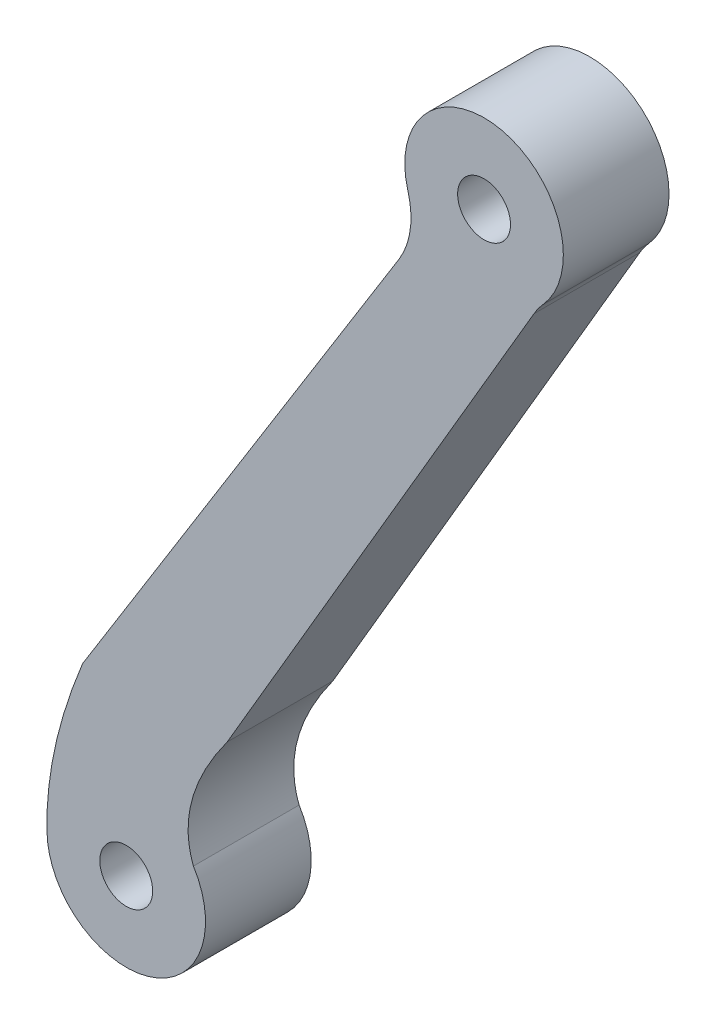
ISO-10303-21;
HEADER;
FILE_DESCRIPTION(('STEP AP214'),'2;1');
FILE_NAME('part.step','',(''),(''),'','','');
FILE_SCHEMA(('AUTOMOTIVE_DESIGN { 1 0 10303 214 1 1 1 1 }'));
ENDSEC;
DATA;
#1=APPLICATION_CONTEXT('core data for automotive mechanical design processes');
#2=APPLICATION_PROTOCOL_DEFINITION('international standard','automotive_design',2000,#1);
#3=PRODUCT_CONTEXT('',#1,'mechanical');
#4=PRODUCT('Part','Part','',(#3));
#5=PRODUCT_RELATED_PRODUCT_CATEGORY('part','',(#4));
#6=PRODUCT_DEFINITION_FORMATION('','',#4);
#7=PRODUCT_DEFINITION_CONTEXT('part definition',#1,'design');
#8=PRODUCT_DEFINITION('design','',#6,#7);
#9=PRODUCT_DEFINITION_SHAPE('','',#8);
#10=(LENGTH_UNIT() NAMED_UNIT(*) SI_UNIT(.MILLI.,.METRE.));
#11=(NAMED_UNIT(*) PLANE_ANGLE_UNIT() SI_UNIT($,.RADIAN.));
#12=(NAMED_UNIT(*) SI_UNIT($,.STERADIAN.) SOLID_ANGLE_UNIT());
#13=UNCERTAINTY_MEASURE_WITH_UNIT(LENGTH_MEASURE(1.E-05),#10,'distance_accuracy_value','');
#14=(GEOMETRIC_REPRESENTATION_CONTEXT(3) GLOBAL_UNCERTAINTY_ASSIGNED_CONTEXT((#13)) GLOBAL_UNIT_ASSIGNED_CONTEXT((#10,
#11,#12)) REPRESENTATION_CONTEXT('',''));
#15=CARTESIAN_POINT('',(0.,0.,0.));
#16=DIRECTION('',(0.,0.,1.));
#17=DIRECTION('',(1.,0.,0.));
#18=AXIS2_PLACEMENT_3D('',#15,#16,#17);
#19=CARTESIAN_POINT('',(18.0164608532114,94.1948252806854,4.));
#20=CARTESIAN_POINT('',(15.9886170182341,91.4157600232767,4.));
#21=CARTESIAN_POINT('',(16.7389516223177,89.4869260874124,4.));
#22=B_SPLINE_CURVE_WITH_KNOTS('',2,(#19,#20,#21),.UNSPECIFIED.,.F.,.F.,(3,3),(0.,1.),.UNSPECIFIED.);
#23=DIRECTION('',(0.,0.,-1.));
#24=VECTOR('',#23,1.);
#25=SURFACE_OF_LINEAR_EXTRUSION('',#22,#24);
#26=CARTESIAN_POINT('',(18.0164608532114,94.1948252806854,0.));
#27=CARTESIAN_POINT('',(15.9886170182341,91.4157600232767,0.));
#28=CARTESIAN_POINT('',(16.7389516223177,89.4869260874124,0.));
#29=B_SPLINE_CURVE_WITH_KNOTS('',2,(#26,#27,#28),.UNSPECIFIED.,.F.,.F.,(3,3),(0.,1.),.UNSPECIFIED.);
#30=CARTESIAN_POINT('',(18.0164608532114,94.1948252806854,0.));
#31=VERTEX_POINT('',#30);
#32=CARTESIAN_POINT('',(16.7389516223177,89.4869260874124,0.));
#33=VERTEX_POINT('',#32);
#34=EDGE_CURVE('E170',#31,#33,#29,.T.);
#35=ORIENTED_EDGE('',*,*,#34,.F.);
#36=DIRECTION('',(0.,0.,-1.));
#37=VECTOR('',#36,1.);
#38=CARTESIAN_POINT('',(18.0164608532114,94.1948252806854,4.));
#39=LINE('',#38,#37);
#40=CARTESIAN_POINT('',(18.0164608532114,94.1948252806854,4.));
#41=VERTEX_POINT('',#40);
#42=EDGE_CURVE('E11',#41,#31,#39,.T.);
#43=ORIENTED_EDGE('',*,*,#42,.F.);
#44=CARTESIAN_POINT('',(16.7389516223177,89.4869260874124,4.));
#45=VERTEX_POINT('',#44);
#46=EDGE_CURVE('E200',#41,#45,#22,.T.);
#47=ORIENTED_EDGE('',*,*,#46,.T.);
#48=DIRECTION('',(0.,0.,-1.));
#49=VECTOR('',#48,1.);
#50=CARTESIAN_POINT('',(16.7389516223177,89.4869260874124,4.));
#51=LINE('',#50,#49);
#52=EDGE_CURVE('E85',#45,#33,#51,.T.);
#53=ORIENTED_EDGE('',*,*,#52,.T.);
#54=EDGE_LOOP('',(#35,#43,#47,#53));
#55=FACE_BOUND('',#54,.T.);
#56=ADVANCED_FACE('F34',(#55),#25,.T.);
#57=CARTESIAN_POINT('',(-27.64151576103,16.1763745397966,4.));
#58=DIRECTION('',(0.863069254822422,-0.505085598072515,0.));
#59=DIRECTION('',(0.505085598072515,0.863069254822422,0.));
#60=AXIS2_PLACEMENT_3D('',#57,#58,#59);
#61=PLANE('',#60);
#62=DIRECTION('',(-0.505085598072515,-0.863069254822422,0.));
#63=VECTOR('',#62,1.);
#64=CARTESIAN_POINT('',(-27.64151576103,16.1763745397966,0.));
#65=LINE('',#64,#63);
#66=CARTESIAN_POINT('',(29.6287438279882,114.037411274176,0.));
#67=VERTEX_POINT('',#66);
#68=EDGE_CURVE('E163',#67,#31,#65,.T.);
#69=ORIENTED_EDGE('',*,*,#68,.F.);
#70=DIRECTION('',(0.,0.,-1.));
#71=VECTOR('',#70,1.);
#72=CARTESIAN_POINT('',(29.6287438279882,114.037411274176,4.));
#73=LINE('',#72,#71);
#74=CARTESIAN_POINT('',(29.6287438279882,114.037411274176,4.));
#75=VERTEX_POINT('',#74);
#76=EDGE_CURVE('E43',#75,#67,#73,.T.);
#77=ORIENTED_EDGE('',*,*,#76,.F.);
#78=DIRECTION('',(-0.505085598072515,-0.863069254822422,0.));
#79=VECTOR('',#78,1.);
#80=CARTESIAN_POINT('',(-27.64151576103,16.1763745397966,4.));
#81=LINE('',#80,#79);
#82=EDGE_CURVE('E212',#75,#41,#81,.T.);
#83=ORIENTED_EDGE('',*,*,#82,.T.);
#84=ORIENTED_EDGE('',*,*,#42,.T.);
#85=EDGE_LOOP('',(#69,#77,#83,#84));
#86=FACE_BOUND('',#85,.T.);
#87=ADVANCED_FACE('F154',(#86),#61,.T.);
#88=CARTESIAN_POINT('',(32.2179515924554,112.522154479959,4.));
#89=DIRECTION('',(0.,0.,-1.));
#90=DIRECTION('',(-1.,0.,0.));
#91=AXIS2_PLACEMENT_3D('',#88,#89,#90);
#92=CYLINDRICAL_SURFACE('',#91,3.00000000000001);
#93=CARTESIAN_POINT('',(32.2179515924554,112.522154479959,0.));
#94=DIRECTION('',(0.,0.,1.));
#95=DIRECTION('',(1.,0.,0.));
#96=AXIS2_PLACEMENT_3D('',#93,#94,#95);
#97=CIRCLE('',#96,3.00000000000001);
#98=CARTESIAN_POINT('',(29.977739071708,114.517511055082,0.));
#99=VERTEX_POINT('',#98);
#100=EDGE_CURVE('E169',#99,#67,#97,.T.);
#101=ORIENTED_EDGE('',*,*,#100,.F.);
#102=DIRECTION('',(0.,0.,-1.));
#103=VECTOR('',#102,1.);
#104=CARTESIAN_POINT('',(29.977739071708,114.517511055082,4.));
#105=LINE('',#104,#103);
#106=CARTESIAN_POINT('',(29.977739071708,114.517511055082,4.));
#107=VERTEX_POINT('',#106);
#108=EDGE_CURVE('E207',#107,#99,#105,.T.);
#109=ORIENTED_EDGE('',*,*,#108,.F.);
#110=CARTESIAN_POINT('',(32.2179515924554,112.522154479959,4.));
#111=DIRECTION('',(0.,0.,1.));
#112=DIRECTION('',(1.,0.,0.));
#113=AXIS2_PLACEMENT_3D('',#110,#111,#112);
#114=CIRCLE('',#113,3.00000000000001);
#115=EDGE_CURVE('E210',#107,#75,#114,.T.);
#116=ORIENTED_EDGE('',*,*,#115,.T.);
#117=ORIENTED_EDGE('',*,*,#76,.T.);
#118=EDGE_LOOP('',(#101,#109,#116,#117));
#119=FACE_BOUND('',#118,.T.);
#120=ADVANCED_FACE('F151',(#119),#92,.F.);
#121=CARTESIAN_POINT('',(27.7375265509606,116.512867630205,4.));
#122=DIRECTION('',(0.,0.,-1.));
#123=DIRECTION('',(-1.,0.,0.));
#124=AXIS2_PLACEMENT_3D('',#121,#122,#123);
#125=CYLINDRICAL_SURFACE('',#124,3.);
#126=CARTESIAN_POINT('',(27.7375265509606,116.512867630205,0.));
#127=DIRECTION('',(0.,0.,1.));
#128=DIRECTION('',(1.,0.,0.));
#129=AXIS2_PLACEMENT_3D('',#126,#127,#128);
#130=CIRCLE('',#129,3.);
#131=CARTESIAN_POINT('',(24.854741228717,115.682476887327,0.));
#132=VERTEX_POINT('',#131);
#133=EDGE_CURVE('E178',#99,#132,#130,.T.);
#134=ORIENTED_EDGE('',*,*,#133,.T.);
#135=DIRECTION('',(0.,0.,-1.));
#136=VECTOR('',#135,1.);
#137=CARTESIAN_POINT('',(24.854741228717,115.682476887327,4.));
#138=LINE('',#137,#136);
#139=CARTESIAN_POINT('',(24.854741228717,115.682476887327,4.));
#140=VERTEX_POINT('',#139);
#141=EDGE_CURVE('E205',#140,#132,#138,.T.);
#142=ORIENTED_EDGE('',*,*,#141,.F.);
#143=CARTESIAN_POINT('',(27.7375265509606,116.512867630205,4.));
#144=DIRECTION('',(0.,0.,1.));
#145=DIRECTION('',(1.,0.,0.));
#146=AXIS2_PLACEMENT_3D('',#143,#144,#145);
#147=CIRCLE('',#146,3.);
#148=EDGE_CURVE('E124',#107,#140,#147,.T.);
#149=ORIENTED_EDGE('',*,*,#148,.F.);
#150=ORIENTED_EDGE('',*,*,#108,.T.);
#151=EDGE_LOOP('',(#134,#142,#149,#150));
#152=FACE_BOUND('',#151,.T.);
#153=ADVANCED_FACE('F147',(#152),#125,.T.);
#154=CARTESIAN_POINT('',(21.9719559064734,114.85208614445,4.));
#155=DIRECTION('',(0.,0.,-1.));
#156=DIRECTION('',(-1.,0.,0.));
#157=AXIS2_PLACEMENT_3D('',#154,#155,#156);
#158=CYLINDRICAL_SURFACE('',#157,3.);
#159=CARTESIAN_POINT('',(21.9719559064734,114.85208614445,0.));
#160=DIRECTION('',(0.,0.,1.));
#161=DIRECTION('',(1.,0.,0.));
#162=AXIS2_PLACEMENT_3D('',#159,#160,#161);
#163=CIRCLE('',#162,3.);
#164=CARTESIAN_POINT('',(24.5189597292417,113.266913747893,0.));
#165=VERTEX_POINT('',#164);
#166=EDGE_CURVE('E180',#165,#132,#163,.T.);
#167=ORIENTED_EDGE('',*,*,#166,.F.);
#168=DIRECTION('',(0.,0.,-1.));
#169=VECTOR('',#168,1.);
#170=CARTESIAN_POINT('',(24.5189597292417,113.266913747893,4.));
#171=LINE('',#170,#169);
#172=CARTESIAN_POINT('',(24.5189597292417,113.266913747893,4.));
#173=VERTEX_POINT('',#172);
#174=EDGE_CURVE('E112',#173,#165,#171,.T.);
#175=ORIENTED_EDGE('',*,*,#174,.F.);
#176=CARTESIAN_POINT('',(21.9719559064734,114.85208614445,4.));
#177=DIRECTION('',(0.,0.,1.));
#178=DIRECTION('',(1.,0.,0.));
#179=AXIS2_PLACEMENT_3D('',#176,#177,#178);
#180=CIRCLE('',#179,3.);
#181=EDGE_CURVE('E122',#173,#140,#180,.T.);
#182=ORIENTED_EDGE('',*,*,#181,.T.);
#183=ORIENTED_EDGE('',*,*,#141,.T.);
#184=EDGE_LOOP('',(#167,#175,#182,#183));
#185=FACE_BOUND('',#184,.T.);
#186=ADVANCED_FACE('F144',(#185),#158,.F.);
#187=CARTESIAN_POINT('',(-33.1386991079217,20.6244492505586,4.));
#188=DIRECTION('',(-0.849001274256077,0.528390798852098,0.));
#189=DIRECTION('',(-0.528390798852098,-0.849001274256077,0.));
#190=AXIS2_PLACEMENT_3D('',#187,#188,#189);
#191=PLANE('',#190);
#192=DIRECTION('',(0.528390798852098,0.849001274256077,0.));
#193=VECTOR('',#192,1.);
#194=CARTESIAN_POINT('',(-33.1386991079217,20.6244492505586,0.));
#195=LINE('',#194,#193);
#196=CARTESIAN_POINT('',(12.5460152334742,94.0291731294213,0.));
#197=VERTEX_POINT('',#196);
#198=EDGE_CURVE('E111',#197,#165,#195,.T.);
#199=ORIENTED_EDGE('',*,*,#198,.F.);
#200=DIRECTION('',(0.,0.,-1.));
#201=VECTOR('',#200,1.);
#202=CARTESIAN_POINT('',(12.5460152334742,94.0291731294213,4.));
#203=LINE('',#202,#201);
#204=CARTESIAN_POINT('',(12.5460152334742,94.0291731294213,4.));
#205=VERTEX_POINT('',#204);
#206=EDGE_CURVE('E105',#205,#197,#203,.T.);
#207=ORIENTED_EDGE('',*,*,#206,.F.);
#208=DIRECTION('',(0.528390798852098,0.849001274256077,0.));
#209=VECTOR('',#208,1.);
#210=CARTESIAN_POINT('',(-33.1386991079217,20.6244492505586,4.));
#211=LINE('',#210,#209);
#212=EDGE_CURVE('E109',#205,#173,#211,.T.);
#213=ORIENTED_EDGE('',*,*,#212,.T.);
#214=ORIENTED_EDGE('',*,*,#174,.T.);
#215=EDGE_LOOP('',(#199,#207,#213,#214));
#216=FACE_BOUND('',#215,.T.);
#217=ADVANCED_FACE('F107',(#216),#191,.T.);
#218=CARTESIAN_POINT('',(12.5460152334742,94.0291731294213,4.));
#219=CARTESIAN_POINT('',(11.1432009751376,90.6207808117427,4.));
#220=CARTESIAN_POINT('',(11.1958575437404,87.8954888415541,4.));
#221=B_SPLINE_CURVE_WITH_KNOTS('',2,(#218,#219,#220),.UNSPECIFIED.,.F.,.F.,(3,3),(0.,1.),.UNSPECIFIED.);
#222=DIRECTION('',(0.,0.,-1.));
#223=VECTOR('',#222,1.);
#224=SURFACE_OF_LINEAR_EXTRUSION('',#221,#223);
#225=CARTESIAN_POINT('',(12.5460152334742,94.0291731294213,0.));
#226=CARTESIAN_POINT('',(11.1432009751376,90.6207808117427,0.));
#227=CARTESIAN_POINT('',(11.1958575437404,87.8954888415541,0.));
#228=B_SPLINE_CURVE_WITH_KNOTS('',2,(#225,#226,#227),.UNSPECIFIED.,.F.,.F.,(3,3),(0.,1.),.UNSPECIFIED.);
#229=CARTESIAN_POINT('',(11.1958575437404,87.8954888415541,0.));
#230=VERTEX_POINT('',#229);
#231=EDGE_CURVE('E78',#197,#230,#228,.T.);
#232=ORIENTED_EDGE('',*,*,#231,.T.);
#233=DIRECTION('',(0.,0.,-1.));
#234=VECTOR('',#233,1.);
#235=CARTESIAN_POINT('',(11.1958575437404,87.8954888415541,4.));
#236=LINE('',#235,#234);
#237=CARTESIAN_POINT('',(11.1958575437404,87.8954888415541,4.));
#238=VERTEX_POINT('',#237);
#239=EDGE_CURVE('E113',#238,#230,#236,.T.);
#240=ORIENTED_EDGE('',*,*,#239,.F.);
#241=EDGE_CURVE('E115',#205,#238,#221,.T.);
#242=ORIENTED_EDGE('',*,*,#241,.F.);
#243=ORIENTED_EDGE('',*,*,#206,.T.);
#244=EDGE_LOOP('',(#232,#240,#242,#243));
#245=FACE_BOUND('',#244,.T.);
#246=ADVANCED_FACE('F116',(#245),#224,.F.);
#247=CARTESIAN_POINT('',(27.7375265509606,116.512867630205,4.));
#248=DIRECTION('',(0.,0.,-1.));
#249=DIRECTION('',(-1.,0.,0.));
#250=AXIS2_PLACEMENT_3D('',#247,#248,#249);
#251=CYLINDRICAL_SURFACE('',#250,1.);
#252=CARTESIAN_POINT('',(27.7375265509606,116.512867630205,4.));
#253=DIRECTION('',(0.,0.,1.));
#254=DIRECTION('',(1.,0.,0.));
#255=AXIS2_PLACEMENT_3D('',#252,#253,#254);
#256=CIRCLE('',#255,1.);
#257=CARTESIAN_POINT('',(28.7375265509606,116.512867630205,4.));
#258=VERTEX_POINT('',#257);
#259=EDGE_CURVE('E229',#258,#258,#256,.T.);
#260=ORIENTED_EDGE('',*,*,#259,.T.);
#261=EDGE_LOOP('',(#260));
#262=FACE_BOUND('',#261,.T.);
#263=CARTESIAN_POINT('',(27.7375265509606,116.512867630205,0.));
#264=DIRECTION('',(0.,0.,1.));
#265=DIRECTION('',(1.,0.,0.));
#266=AXIS2_PLACEMENT_3D('',#263,#264,#265);
#267=CIRCLE('',#266,1.);
#268=CARTESIAN_POINT('',(28.7375265509606,116.512867630205,0.));
#269=VERTEX_POINT('',#268);
#270=EDGE_CURVE('E194',#269,#269,#267,.T.);
#271=ORIENTED_EDGE('',*,*,#270,.F.);
#272=EDGE_LOOP('',(#271));
#273=FACE_BOUND('',#272,.T.);
#274=ADVANCED_FACE('F139',(#262,#273),#251,.F.);
#275=CARTESIAN_POINT('',(14.1958575437404,87.8954888415541,4.));
#276=DIRECTION('',(0.,0.,-1.));
#277=DIRECTION('',(-1.,0.,0.));
#278=AXIS2_PLACEMENT_3D('',#275,#276,#277);
#279=CYLINDRICAL_SURFACE('',#278,3.);
#280=CARTESIAN_POINT('',(14.1958575437404,87.8954888415541,0.));
#281=DIRECTION('',(0.,0.,1.));
#282=DIRECTION('',(1.,0.,0.));
#283=AXIS2_PLACEMENT_3D('',#280,#281,#282);
#284=CIRCLE('',#283,3.);
#285=EDGE_CURVE('E189',#230,#33,#284,.T.);
#286=ORIENTED_EDGE('',*,*,#285,.T.);
#287=ORIENTED_EDGE('',*,*,#52,.F.);
#288=CARTESIAN_POINT('',(14.1958575437404,87.8954888415541,4.));
#289=DIRECTION('',(0.,0.,1.));
#290=DIRECTION('',(1.,0.,0.));
#291=AXIS2_PLACEMENT_3D('',#288,#289,#290);
#292=CIRCLE('',#291,3.);
#293=EDGE_CURVE('E51',#238,#45,#292,.T.);
#294=ORIENTED_EDGE('',*,*,#293,.F.);
#295=ORIENTED_EDGE('',*,*,#239,.T.);
#296=EDGE_LOOP('',(#286,#287,#294,#295));
#297=FACE_BOUND('',#296,.T.);
#298=ADVANCED_FACE('F140',(#297),#279,.T.);
#299=CARTESIAN_POINT('',(14.1958575437404,87.8954888415541,4.));
#300=DIRECTION('',(0.,0.,-1.));
#301=DIRECTION('',(-1.,0.,0.));
#302=AXIS2_PLACEMENT_3D('',#299,#300,#301);
#303=CYLINDRICAL_SURFACE('',#302,1.);
#304=CARTESIAN_POINT('',(14.1958575437404,87.8954888415541,4.));
#305=DIRECTION('',(0.,0.,1.));
#306=DIRECTION('',(1.,0.,0.));
#307=AXIS2_PLACEMENT_3D('',#304,#305,#306);
#308=CIRCLE('',#307,1.);
#309=CARTESIAN_POINT('',(15.1958575437404,87.8954888415541,4.));
#310=VERTEX_POINT('',#309);
#311=EDGE_CURVE('E202',#310,#310,#308,.T.);
#312=ORIENTED_EDGE('',*,*,#311,.T.);
#313=EDGE_LOOP('',(#312));
#314=FACE_BOUND('',#313,.T.);
#315=CARTESIAN_POINT('',(14.1958575437404,87.8954888415541,0.));
#316=DIRECTION('',(0.,0.,1.));
#317=DIRECTION('',(1.,0.,0.));
#318=AXIS2_PLACEMENT_3D('',#315,#316,#317);
#319=CIRCLE('',#318,1.);
#320=CARTESIAN_POINT('',(15.1958575437404,87.8954888415541,0.));
#321=VERTEX_POINT('',#320);
#322=EDGE_CURVE('E197',#321,#321,#319,.T.);
#323=ORIENTED_EDGE('',*,*,#322,.F.);
#324=EDGE_LOOP('',(#323));
#325=FACE_BOUND('',#324,.T.);
#326=ADVANCED_FACE('F236',(#314,#325),#303,.F.);
#327=CARTESIAN_POINT('',(0.,0.,4.));
#328=DIRECTION('',(0.,0.,1.));
#329=DIRECTION('',(1.,0.,0.));
#330=AXIS2_PLACEMENT_3D('',#327,#328,#329);
#331=PLANE('',#330);
#332=ORIENTED_EDGE('',*,*,#46,.F.);
#333=ORIENTED_EDGE('',*,*,#82,.F.);
#334=ORIENTED_EDGE('',*,*,#115,.F.);
#335=ORIENTED_EDGE('',*,*,#148,.T.);
#336=ORIENTED_EDGE('',*,*,#181,.F.);
#337=ORIENTED_EDGE('',*,*,#212,.F.);
#338=ORIENTED_EDGE('',*,*,#241,.T.);
#339=ORIENTED_EDGE('',*,*,#293,.T.);
#340=EDGE_LOOP('',(#332,#333,#334,#335,#336,#337,#338,#339));
#341=FACE_BOUND('',#340,.T.);
#342=ORIENTED_EDGE('',*,*,#259,.F.);
#343=EDGE_LOOP('',(#342));
#344=FACE_BOUND('',#343,.T.);
#345=ORIENTED_EDGE('',*,*,#311,.F.);
#346=EDGE_LOOP('',(#345));
#347=FACE_BOUND('',#346,.T.);
#348=ADVANCED_FACE('F119',(#341,#344,#347),#331,.T.);
#349=CARTESIAN_POINT('',(0.,0.,0.));
#350=DIRECTION('',(0.,0.,1.));
#351=DIRECTION('',(1.,0.,0.));
#352=AXIS2_PLACEMENT_3D('',#349,#350,#351);
#353=PLANE('',#352);
#354=ORIENTED_EDGE('',*,*,#34,.T.);
#355=ORIENTED_EDGE('',*,*,#285,.F.);
#356=ORIENTED_EDGE('',*,*,#231,.F.);
#357=ORIENTED_EDGE('',*,*,#198,.T.);
#358=ORIENTED_EDGE('',*,*,#166,.T.);
#359=ORIENTED_EDGE('',*,*,#133,.F.);
#360=ORIENTED_EDGE('',*,*,#100,.T.);
#361=ORIENTED_EDGE('',*,*,#68,.T.);
#362=EDGE_LOOP('',(#354,#355,#356,#357,#358,#359,#360,#361));
#363=FACE_BOUND('',#362,.T.);
#364=ORIENTED_EDGE('',*,*,#270,.T.);
#365=EDGE_LOOP('',(#364));
#366=FACE_BOUND('',#365,.T.);
#367=ORIENTED_EDGE('',*,*,#322,.T.);
#368=EDGE_LOOP('',(#367));
#369=FACE_BOUND('',#368,.T.);
#370=ADVANCED_FACE('F174',(#363,#366,#369),#353,.F.);
#371=CLOSED_SHELL('',(#56,#87,#120,#153,#186,#217,#246,#274,#298,#326,#348,#370));
#372=MANIFOLD_SOLID_BREP('B2',#371);
#373=ADVANCED_BREP_SHAPE_REPRESENTATION('',(#18,#372),#14);
#374=SHAPE_DEFINITION_REPRESENTATION(#9,#373);
ENDSEC;
END-ISO-10303-21;
